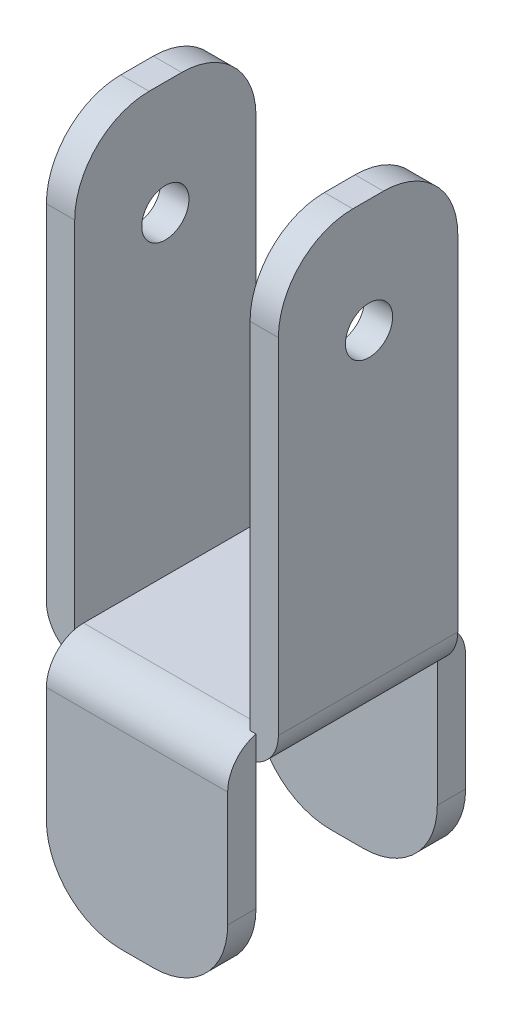
ISO-10303-21;
HEADER;
FILE_DESCRIPTION(('STEP AP214'),'2;1');
FILE_NAME('part.step','',(''),(''),'','','');
FILE_SCHEMA(('AUTOMOTIVE_DESIGN { 1 0 10303 214 1 1 1 1 }'));
ENDSEC;
DATA;
#1=APPLICATION_CONTEXT('core data for automotive mechanical design processes');
#2=APPLICATION_PROTOCOL_DEFINITION('international standard','automotive_design',2000,#1);
#3=PRODUCT_CONTEXT('',#1,'mechanical');
#4=PRODUCT('Part','Part','',(#3));
#5=PRODUCT_RELATED_PRODUCT_CATEGORY('part','',(#4));
#6=PRODUCT_DEFINITION_FORMATION('','',#4);
#7=PRODUCT_DEFINITION_CONTEXT('part definition',#1,'design');
#8=PRODUCT_DEFINITION('design','',#6,#7);
#9=PRODUCT_DEFINITION_SHAPE('','',#8);
#10=(LENGTH_UNIT() NAMED_UNIT(*) SI_UNIT(.MILLI.,.METRE.));
#11=(NAMED_UNIT(*) PLANE_ANGLE_UNIT() SI_UNIT($,.RADIAN.));
#12=(NAMED_UNIT(*) SI_UNIT($,.STERADIAN.) SOLID_ANGLE_UNIT());
#13=UNCERTAINTY_MEASURE_WITH_UNIT(LENGTH_MEASURE(1.E-05),#10,'distance_accuracy_value','');
#14=(GEOMETRIC_REPRESENTATION_CONTEXT(3) GLOBAL_UNCERTAINTY_ASSIGNED_CONTEXT((#13)) GLOBAL_UNIT_ASSIGNED_CONTEXT((#10,
#11,#12)) REPRESENTATION_CONTEXT('',''));
#15=CARTESIAN_POINT('',(0.,0.,0.));
#16=DIRECTION('',(0.,0.,1.));
#17=DIRECTION('',(1.,0.,0.));
#18=AXIS2_PLACEMENT_3D('',#15,#16,#17);
#19=CARTESIAN_POINT('',(3.81,-10.0000000000001,0.));
#20=DIRECTION('',(0.,0.,-1.));
#21=DIRECTION('',(-1.,0.,0.));
#22=AXIS2_PLACEMENT_3D('',#19,#20,#21);
#23=PLANE('',#22);
#24=DIRECTION('',(0.,-1.,0.));
#25=VECTOR('',#24,1.);
#26=CARTESIAN_POINT('',(3.81,-57.5348733929534,0.));
#27=LINE('',#26,#25);
#28=CARTESIAN_POINT('',(3.81,-57.6785476213438,0.));
#29=VERTEX_POINT('',#28);
#30=CARTESIAN_POINT('',(3.81,-61.201199164563,0.));
#31=VERTEX_POINT('',#30);
#32=EDGE_CURVE('E355',#29,#31,#27,.T.);
#33=ORIENTED_EDGE('',*,*,#32,.F.);
#34=DIRECTION('',(0.,-1.,0.));
#35=VECTOR('',#34,1.);
#36=CARTESIAN_POINT('',(3.81,-10.0000000000001,0.));
#37=LINE('',#36,#35);
#38=CARTESIAN_POINT('',(3.81,-10.0000000000001,0.));
#39=VERTEX_POINT('',#38);
#40=EDGE_CURVE('E418',#39,#29,#37,.T.);
#41=ORIENTED_EDGE('',*,*,#40,.F.);
#42=DIRECTION('',(-1.,0.,0.));
#43=VECTOR('',#42,1.);
#44=CARTESIAN_POINT('',(3.81,-10.0000000000001,0.));
#45=LINE('',#44,#43);
#46=CARTESIAN_POINT('',(0.,-10.0000000000001,0.));
#47=VERTEX_POINT('',#46);
#48=EDGE_CURVE('E422',#39,#47,#45,.T.);
#49=ORIENTED_EDGE('',*,*,#48,.T.);
#50=DIRECTION('',(0.,-1.,0.));
#51=VECTOR('',#50,1.);
#52=CARTESIAN_POINT('',(0.,-10.0000000000001,0.));
#53=LINE('',#52,#51);
#54=CARTESIAN_POINT('',(0.,-56.3448733929534,0.));
#55=VERTEX_POINT('',#54);
#56=EDGE_CURVE('E412',#47,#55,#53,.T.);
#57=ORIENTED_EDGE('',*,*,#56,.T.);
#58=CARTESIAN_POINT('',(5.,-56.3448733929534,0.));
#59=DIRECTION('',(0.,0.,-1.));
#60=DIRECTION('',(-1.,0.,0.));
#61=AXIS2_PLACEMENT_3D('',#58,#59,#60);
#62=CIRCLE('',#61,5.);
#63=EDGE_CURVE('E260',#55,#31,#62,.F.);
#64=ORIENTED_EDGE('',*,*,#63,.T.);
#65=EDGE_LOOP('',(#33,#41,#49,#57,#64));
#66=FACE_BOUND('',#65,.T.);
#67=ADVANCED_FACE('F33',(#66),#23,.F.);
#68=DIRECTION('',(0.,1.,0.));
#69=VECTOR('',#68,1.);
#70=CARTESIAN_POINT('',(28.194,-57.5348733929534,0.));
#71=LINE('',#70,#69);
#72=CARTESIAN_POINT('',(28.194,-60.9318642554384,0.));
#73=VERTEX_POINT('',#72);
#74=CARTESIAN_POINT('',(28.194,-57.6785476213438,0.));
#75=VERTEX_POINT('',#74);
#76=EDGE_CURVE('E339',#73,#75,#71,.T.);
#77=ORIENTED_EDGE('',*,*,#76,.F.);
#78=CARTESIAN_POINT('',(26.2041470337036,-56.3448733929534,0.));
#79=DIRECTION('',(0.,0.,-1.));
#80=DIRECTION('',(-1.,0.,0.));
#81=AXIS2_PLACEMENT_3D('',#78,#79,#80);
#82=CIRCLE('',#81,5.);
#83=CARTESIAN_POINT('',(31.2041470337036,-56.3448733929534,0.));
#84=VERTEX_POINT('',#83);
#85=EDGE_CURVE('E472',#73,#84,#82,.F.);
#86=ORIENTED_EDGE('',*,*,#85,.T.);
#87=DIRECTION('',(0.,-1.,0.));
#88=VECTOR('',#87,1.);
#89=CARTESIAN_POINT('',(31.2041470337036,-61.3448733929534,0.));
#90=LINE('',#89,#88);
#91=CARTESIAN_POINT('',(31.2041470337036,-10.,0.));
#92=VERTEX_POINT('',#91);
#93=EDGE_CURVE('E382',#92,#84,#90,.T.);
#94=ORIENTED_EDGE('',*,*,#93,.F.);
#95=DIRECTION('',(-1.,0.,0.));
#96=VECTOR('',#95,1.);
#97=CARTESIAN_POINT('',(3.81,-10.,0.));
#98=LINE('',#97,#96);
#99=CARTESIAN_POINT('',(27.3941470337036,-10.,0.));
#100=VERTEX_POINT('',#99);
#101=EDGE_CURVE('E453',#92,#100,#98,.T.);
#102=ORIENTED_EDGE('',*,*,#101,.T.);
#103=DIRECTION('',(0.,-1.,0.));
#104=VECTOR('',#103,1.);
#105=CARTESIAN_POINT('',(27.3941470337036,-61.3448733929534,0.));
#106=LINE('',#105,#104);
#107=CARTESIAN_POINT('',(27.3941470337036,-57.6785476213438,0.));
#108=VERTEX_POINT('',#107);
#109=EDGE_CURVE('E48',#100,#108,#106,.T.);
#110=ORIENTED_EDGE('',*,*,#109,.T.);
#111=DIRECTION('',(-1.,0.,0.));
#112=VECTOR('',#111,1.);
#113=CARTESIAN_POINT('',(27.3941470337036,-57.6785476213438,0.));
#114=LINE('',#113,#112);
#115=EDGE_CURVE('E11',#108,#75,#114,.F.);
#116=ORIENTED_EDGE('',*,*,#115,.T.);
#117=EDGE_LOOP('',(#77,#86,#94,#102,#110,#116));
#118=FACE_BOUND('',#117,.T.);
#119=ADVANCED_FACE('F551',(#118),#23,.F.);
#120=CARTESIAN_POINT('',(3.81,-10.,-24.384));
#121=DIRECTION('',(0.,0.,1.));
#122=DIRECTION('',(0.,-1.,0.));
#123=AXIS2_PLACEMENT_3D('',#120,#121,#122);
#124=PLANE('',#123);
#125=DIRECTION('',(1.,0.,0.));
#126=VECTOR('',#125,1.);
#127=CARTESIAN_POINT('',(3.81,-57.693007505037,-24.384));
#128=LINE('',#127,#126);
#129=CARTESIAN_POINT('',(3.81,-57.693007505037,-24.384));
#130=VERTEX_POINT('',#129);
#131=CARTESIAN_POINT('',(27.3941470337036,-57.693007505037,-24.384));
#132=VERTEX_POINT('',#131);
#133=EDGE_CURVE('E349',#130,#132,#128,.T.);
#134=ORIENTED_EDGE('',*,*,#133,.F.);
#135=DIRECTION('',(0.,-1.,0.));
#136=VECTOR('',#135,1.);
#137=CARTESIAN_POINT('',(3.81,-57.693007505037,-24.384));
#138=LINE('',#137,#136);
#139=CARTESIAN_POINT('',(3.81,-61.201199164563,-24.384));
#140=VERTEX_POINT('',#139);
#141=EDGE_CURVE('E366',#130,#140,#138,.T.);
#142=ORIENTED_EDGE('',*,*,#141,.T.);
#143=CARTESIAN_POINT('',(5.,-56.3448733929534,-24.384));
#144=DIRECTION('',(0.,0.,1.));
#145=DIRECTION('',(0.,-1.,0.));
#146=AXIS2_PLACEMENT_3D('',#143,#144,#145);
#147=CIRCLE('',#146,5.);
#148=CARTESIAN_POINT('',(0.,-56.3448733929534,-24.384));
#149=VERTEX_POINT('',#148);
#150=EDGE_CURVE('E241',#140,#149,#147,.F.);
#151=ORIENTED_EDGE('',*,*,#150,.T.);
#152=DIRECTION('',(0.,1.,0.));
#153=VECTOR('',#152,1.);
#154=CARTESIAN_POINT('',(0.,-10.,-24.384));
#155=LINE('',#154,#153);
#156=CARTESIAN_POINT('',(0.,-10.,-24.384));
#157=VERTEX_POINT('',#156);
#158=EDGE_CURVE('E407',#149,#157,#155,.T.);
#159=ORIENTED_EDGE('',*,*,#158,.T.);
#160=DIRECTION('',(-1.,0.,0.));
#161=VECTOR('',#160,1.);
#162=CARTESIAN_POINT('',(3.81,-10.,-24.384));
#163=LINE('',#162,#161);
#164=CARTESIAN_POINT('',(3.81,-10.,-24.384));
#165=VERTEX_POINT('',#164);
#166=EDGE_CURVE('E440',#165,#157,#163,.T.);
#167=ORIENTED_EDGE('',*,*,#166,.F.);
#168=DIRECTION('',(0.,1.,0.));
#169=VECTOR('',#168,1.);
#170=CARTESIAN_POINT('',(3.81,-10.,-24.384));
#171=LINE('',#170,#169);
#172=CARTESIAN_POINT('',(3.81,-57.5348733929534,-24.384));
#173=VERTEX_POINT('',#172);
#174=EDGE_CURVE('E408',#173,#165,#171,.T.);
#175=ORIENTED_EDGE('',*,*,#174,.F.);
#176=DIRECTION('',(1.,0.,0.));
#177=VECTOR('',#176,1.);
#178=CARTESIAN_POINT('',(0.,-57.5348733929534,-24.384));
#179=LINE('',#178,#177);
#180=CARTESIAN_POINT('',(27.3941470337036,-57.5348733929534,-24.384));
#181=VERTEX_POINT('',#180);
#182=EDGE_CURVE('E391',#173,#181,#179,.T.);
#183=ORIENTED_EDGE('',*,*,#182,.T.);
#184=DIRECTION('',(0.,1.,0.));
#185=VECTOR('',#184,1.);
#186=CARTESIAN_POINT('',(27.3941470337036,-61.3448733929534,-24.384));
#187=LINE('',#186,#185);
#188=EDGE_CURVE('E252',#132,#181,#187,.T.);
#189=ORIENTED_EDGE('',*,*,#188,.F.);
#190=EDGE_LOOP('',(#134,#142,#151,#159,#167,#175,#183,#189));
#191=FACE_BOUND('',#190,.T.);
#192=ADVANCED_FACE('F478',(#191),#124,.F.);
#193=CARTESIAN_POINT('',(27.3941470337036,-61.3448733929534,-24.384));
#194=DIRECTION('',(-1.,0.,0.));
#195=DIRECTION('',(0.,0.,1.));
#196=AXIS2_PLACEMENT_3D('',#193,#194,#195);
#197=PLANE('',#196);
#198=DIRECTION('',(0.,1.,0.));
#199=VECTOR('',#198,1.);
#200=CARTESIAN_POINT('',(27.3941470337036,-61.3448733929534,-24.13));
#201=LINE('',#200,#199);
#202=CARTESIAN_POINT('',(27.3941470337036,-61.201199164563,-24.13));
#203=VERTEX_POINT('',#202);
#204=CARTESIAN_POINT('',(27.3941470337036,-57.5348733929534,-24.13));
#205=VERTEX_POINT('',#204);
#206=EDGE_CURVE('E394',#203,#205,#201,.T.);
#207=ORIENTED_EDGE('',*,*,#206,.F.);
#208=DIRECTION('',(0.,0.,-1.));
#209=VECTOR('',#208,1.);
#210=CARTESIAN_POINT('',(27.3941470337036,-61.201199164563,-24.13));
#211=LINE('',#210,#209);
#212=CARTESIAN_POINT('',(27.3941470337036,-61.201199164563,-24.384));
#213=VERTEX_POINT('',#212);
#214=EDGE_CURVE('E466',#203,#213,#211,.T.);
#215=ORIENTED_EDGE('',*,*,#214,.T.);
#216=EDGE_CURVE('E404',#213,#132,#187,.T.);
#217=ORIENTED_EDGE('',*,*,#216,.T.);
#218=ORIENTED_EDGE('',*,*,#188,.T.);
#219=DIRECTION('',(0.,0.,1.));
#220=VECTOR('',#219,1.);
#221=CARTESIAN_POINT('',(27.3941470337036,-57.5348733929534,-24.384));
#222=LINE('',#221,#220);
#223=EDGE_CURVE('E398',#181,#205,#222,.T.);
#224=ORIENTED_EDGE('',*,*,#223,.T.);
#225=EDGE_LOOP('',(#207,#215,#217,#218,#224));
#226=FACE_BOUND('',#225,.T.);
#227=ADVANCED_FACE('F513',(#226),#197,.F.);
#228=CARTESIAN_POINT('',(3.81,-10.,-14.384));
#229=DIRECTION('',(-1.,0.,0.));
#230=DIRECTION('',(0.,0.,1.));
#231=AXIS2_PLACEMENT_3D('',#228,#229,#230);
#232=CYLINDRICAL_SURFACE('',#231,10.);
#233=CARTESIAN_POINT('',(0.,-10.,-14.384));
#234=DIRECTION('',(1.,0.,0.));
#235=DIRECTION('',(0.,0.,1.));
#236=AXIS2_PLACEMENT_3D('',#233,#234,#235);
#237=CIRCLE('',#236,10.);
#238=CARTESIAN_POINT('',(0.,0.,-14.384));
#239=VERTEX_POINT('',#238);
#240=EDGE_CURVE('E424',#157,#239,#237,.T.);
#241=ORIENTED_EDGE('',*,*,#240,.T.);
#242=DIRECTION('',(-1.,0.,0.));
#243=VECTOR('',#242,1.);
#244=CARTESIAN_POINT('',(3.81,0.,-14.384));
#245=LINE('',#244,#243);
#246=CARTESIAN_POINT('',(3.81,0.,-14.384));
#247=VERTEX_POINT('',#246);
#248=EDGE_CURVE('E437',#247,#239,#245,.T.);
#249=ORIENTED_EDGE('',*,*,#248,.F.);
#250=CARTESIAN_POINT('',(3.81,-10.,-14.384));
#251=DIRECTION('',(1.,0.,0.));
#252=DIRECTION('',(0.,0.,1.));
#253=AXIS2_PLACEMENT_3D('',#250,#251,#252);
#254=CIRCLE('',#253,10.);
#255=EDGE_CURVE('E411',#165,#247,#254,.T.);
#256=ORIENTED_EDGE('',*,*,#255,.F.);
#257=ORIENTED_EDGE('',*,*,#166,.T.);
#258=EDGE_LOOP('',(#241,#249,#256,#257));
#259=FACE_BOUND('',#258,.T.);
#260=ADVANCED_FACE('F502',(#259),#232,.T.);
#261=CARTESIAN_POINT('',(3.81,0.,-10.0000000000001));
#262=DIRECTION('',(0.,-1.,0.));
#263=DIRECTION('',(0.,0.,-1.));
#264=AXIS2_PLACEMENT_3D('',#261,#262,#263);
#265=PLANE('',#264);
#266=DIRECTION('',(0.,0.,1.));
#267=VECTOR('',#266,1.);
#268=CARTESIAN_POINT('',(0.,0.,-10.0000000000001));
#269=LINE('',#268,#267);
#270=CARTESIAN_POINT('',(0.,0.,-10.0000000000001));
#271=VERTEX_POINT('',#270);
#272=EDGE_CURVE('E426',#239,#271,#269,.T.);
#273=ORIENTED_EDGE('',*,*,#272,.T.);
#274=DIRECTION('',(-1.,0.,0.));
#275=VECTOR('',#274,1.);
#276=CARTESIAN_POINT('',(3.81,0.,-10.0000000000001));
#277=LINE('',#276,#275);
#278=CARTESIAN_POINT('',(3.81,0.,-10.0000000000001));
#279=VERTEX_POINT('',#278);
#280=EDGE_CURVE('E434',#279,#271,#277,.T.);
#281=ORIENTED_EDGE('',*,*,#280,.F.);
#282=DIRECTION('',(0.,0.,1.));
#283=VECTOR('',#282,1.);
#284=CARTESIAN_POINT('',(3.81,0.,-10.0000000000001));
#285=LINE('',#284,#283);
#286=EDGE_CURVE('E414',#247,#279,#285,.T.);
#287=ORIENTED_EDGE('',*,*,#286,.F.);
#288=ORIENTED_EDGE('',*,*,#248,.T.);
#289=EDGE_LOOP('',(#273,#281,#287,#288));
#290=FACE_BOUND('',#289,.T.);
#291=ADVANCED_FACE('F499',(#290),#265,.F.);
#292=CARTESIAN_POINT('',(3.81,-10.,-10.));
#293=DIRECTION('',(-1.,0.,0.));
#294=DIRECTION('',(0.,0.,1.));
#295=AXIS2_PLACEMENT_3D('',#292,#293,#294);
#296=CYLINDRICAL_SURFACE('',#295,10.);
#297=CARTESIAN_POINT('',(0.,-10.,-10.));
#298=DIRECTION('',(1.,0.,0.));
#299=DIRECTION('',(0.,0.,-1.));
#300=AXIS2_PLACEMENT_3D('',#297,#298,#299);
#301=CIRCLE('',#300,10.);
#302=EDGE_CURVE('E428',#271,#47,#301,.T.);
#303=ORIENTED_EDGE('',*,*,#302,.T.);
#304=ORIENTED_EDGE('',*,*,#48,.F.);
#305=CARTESIAN_POINT('',(3.81,-10.,-10.));
#306=DIRECTION('',(1.,0.,0.));
#307=DIRECTION('',(0.,0.,-1.));
#308=AXIS2_PLACEMENT_3D('',#305,#306,#307);
#309=CIRCLE('',#308,10.);
#310=EDGE_CURVE('E416',#279,#39,#309,.T.);
#311=ORIENTED_EDGE('',*,*,#310,.F.);
#312=ORIENTED_EDGE('',*,*,#280,.T.);
#313=EDGE_LOOP('',(#303,#304,#311,#312));
#314=FACE_BOUND('',#313,.T.);
#315=ADVANCED_FACE('F494',(#314),#296,.T.);
#316=CARTESIAN_POINT('',(3.81,-10.,-10.));
#317=DIRECTION('',(1.,0.,0.));
#318=DIRECTION('',(0.,0.,-1.));
#319=AXIS2_PLACEMENT_3D('',#316,#317,#318);
#320=PLANE('',#319);
#321=CARTESIAN_POINT('',(3.81,-15.24,-12.192));
#322=DIRECTION('',(1.,0.,0.));
#323=DIRECTION('',(0.,0.,-1.));
#324=AXIS2_PLACEMENT_3D('',#321,#322,#323);
#325=CIRCLE('',#324,3.17499999999999);
#326=CARTESIAN_POINT('',(3.81,-15.24,-15.367));
#327=VERTEX_POINT('',#326);
#328=EDGE_CURVE('E37',#327,#327,#325,.T.);
#329=ORIENTED_EDGE('',*,*,#328,.F.);
#330=EDGE_LOOP('',(#329));
#331=FACE_BOUND('',#330,.T.);
#332=ORIENTED_EDGE('',*,*,#174,.T.);
#333=ORIENTED_EDGE('',*,*,#255,.T.);
#334=ORIENTED_EDGE('',*,*,#286,.T.);
#335=ORIENTED_EDGE('',*,*,#310,.T.);
#336=ORIENTED_EDGE('',*,*,#40,.T.);
#337=CARTESIAN_POINT('',(3.81,-62.5348733929534,-1.19));
#338=DIRECTION('',(1.,0.,0.));
#339=DIRECTION('',(0.,0.,-1.));
#340=AXIS2_PLACEMENT_3D('',#337,#338,#339);
#341=CIRCLE('',#340,5.);
#342=CARTESIAN_POINT('',(3.81,-57.5348733929534,-1.19));
#343=VERTEX_POINT('',#342);
#344=EDGE_CURVE('E320',#29,#343,#341,.F.);
#345=ORIENTED_EDGE('',*,*,#344,.T.);
#346=DIRECTION('',(0.,0.,-1.));
#347=VECTOR('',#346,1.);
#348=CARTESIAN_POINT('',(3.81,-57.5348733929534,0.));
#349=LINE('',#348,#347);
#350=EDGE_CURVE('E420',#343,#173,#349,.T.);
#351=ORIENTED_EDGE('',*,*,#350,.T.);
#352=EDGE_LOOP('',(#332,#333,#334,#335,#336,#345,#351));
#353=FACE_BOUND('',#352,.T.);
#354=ADVANCED_FACE('F507',(#331,#353),#320,.T.);
#355=CARTESIAN_POINT('',(0.,-10.,-10.));
#356=DIRECTION('',(1.,0.,0.));
#357=DIRECTION('',(0.,0.,-1.));
#358=AXIS2_PLACEMENT_3D('',#355,#356,#357);
#359=PLANE('',#358);
#360=CARTESIAN_POINT('',(0.,-15.24,-12.192));
#361=DIRECTION('',(-1.,0.,0.));
#362=DIRECTION('',(0.,0.,1.));
#363=AXIS2_PLACEMENT_3D('',#360,#361,#362);
#364=CIRCLE('',#363,3.175);
#365=CARTESIAN_POINT('',(0.,-15.24,-9.017));
#366=VERTEX_POINT('',#365);
#367=EDGE_CURVE('E618',#366,#366,#364,.T.);
#368=ORIENTED_EDGE('',*,*,#367,.F.);
#369=EDGE_LOOP('',(#368));
#370=FACE_BOUND('',#369,.T.);
#371=ORIENTED_EDGE('',*,*,#158,.F.);
#372=DIRECTION('',(0.,0.,-1.));
#373=VECTOR('',#372,1.);
#374=CARTESIAN_POINT('',(0.,-56.3448733929534,-10.));
#375=LINE('',#374,#373);
#376=EDGE_CURVE('E261',#149,#55,#375,.F.);
#377=ORIENTED_EDGE('',*,*,#376,.T.);
#378=ORIENTED_EDGE('',*,*,#56,.F.);
#379=ORIENTED_EDGE('',*,*,#302,.F.);
#380=ORIENTED_EDGE('',*,*,#272,.F.);
#381=ORIENTED_EDGE('',*,*,#240,.F.);
#382=EDGE_LOOP('',(#371,#377,#378,#379,#380,#381));
#383=FACE_BOUND('',#382,.T.);
#384=ADVANCED_FACE('F484',(#370,#383),#359,.F.);
#385=CARTESIAN_POINT('',(0.,-57.5348733929534,0.));
#386=DIRECTION('',(0.,1.,0.));
#387=DIRECTION('',(0.,0.,1.));
#388=AXIS2_PLACEMENT_3D('',#385,#386,#387);
#389=PLANE('',#388);
#390=ORIENTED_EDGE('',*,*,#350,.F.);
#391=DIRECTION('',(-1.,0.,0.));
#392=VECTOR('',#391,1.);
#393=CARTESIAN_POINT('',(0.,-57.5348733929534,-1.19));
#394=LINE('',#393,#392);
#395=CARTESIAN_POINT('',(27.3941470337036,-57.5348733929534,-1.19));
#396=VERTEX_POINT('',#395);
#397=EDGE_CURVE('E316',#343,#396,#394,.F.);
#398=ORIENTED_EDGE('',*,*,#397,.T.);
#399=EDGE_CURVE('E328',#205,#396,#222,.T.);
#400=ORIENTED_EDGE('',*,*,#399,.F.);
#401=ORIENTED_EDGE('',*,*,#223,.F.);
#402=ORIENTED_EDGE('',*,*,#182,.F.);
#403=EDGE_LOOP('',(#390,#398,#400,#401,#402));
#404=FACE_BOUND('',#403,.T.);
#405=ADVANCED_FACE('F510',(#404),#389,.T.);
#406=CARTESIAN_POINT('',(0.,-61.3448733929534,0.));
#407=DIRECTION('',(0.,1.,0.));
#408=DIRECTION('',(0.,0.,1.));
#409=AXIS2_PLACEMENT_3D('',#406,#407,#408);
#410=PLANE('',#409);
#411=DIRECTION('',(-1.,0.,0.));
#412=VECTOR('',#411,1.);
#413=CARTESIAN_POINT('',(0.,-61.3448733929534,0.));
#414=LINE('',#413,#412);
#415=CARTESIAN_POINT('',(26.2041470337036,-61.3448733929534,0.));
#416=VERTEX_POINT('',#415);
#417=CARTESIAN_POINT('',(5.,-61.3448733929534,0.));
#418=VERTEX_POINT('',#417);
#419=EDGE_CURVE('E245',#416,#418,#414,.T.);
#420=ORIENTED_EDGE('',*,*,#419,.T.);
#421=DIRECTION('',(0.,0.,-1.));
#422=VECTOR('',#421,1.);
#423=CARTESIAN_POINT('',(5.,-61.3448733929534,0.));
#424=LINE('',#423,#422);
#425=CARTESIAN_POINT('',(5.,-61.3448733929534,-24.384));
#426=VERTEX_POINT('',#425);
#427=EDGE_CURVE('E230',#418,#426,#424,.T.);
#428=ORIENTED_EDGE('',*,*,#427,.T.);
#429=DIRECTION('',(1.,0.,0.));
#430=VECTOR('',#429,1.);
#431=CARTESIAN_POINT('',(0.,-61.3448733929534,-24.384));
#432=LINE('',#431,#430);
#433=CARTESIAN_POINT('',(26.2041470337036,-61.3448733929534,-24.384));
#434=VERTEX_POINT('',#433);
#435=EDGE_CURVE('E253',#426,#434,#432,.T.);
#436=ORIENTED_EDGE('',*,*,#435,.T.);
#437=DIRECTION('',(0.,0.,-1.));
#438=VECTOR('',#437,1.);
#439=CARTESIAN_POINT('',(26.2041470337036,-61.3448733929534,0.));
#440=LINE('',#439,#438);
#441=EDGE_CURVE('E248',#434,#416,#440,.F.);
#442=ORIENTED_EDGE('',*,*,#441,.T.);
#443=EDGE_LOOP('',(#420,#428,#436,#442));
#444=FACE_BOUND('',#443,.T.);
#445=ADVANCED_FACE('F246',(#444),#410,.F.);
#446=CARTESIAN_POINT('',(31.2041470337036,-61.3448733929534,-24.13));
#447=DIRECTION('',(0.,0.,1.));
#448=DIRECTION('',(1.,0.,0.));
#449=AXIS2_PLACEMENT_3D('',#446,#447,#448);
#450=PLANE('',#449);
#451=DIRECTION('',(0.,1.,0.));
#452=VECTOR('',#451,1.);
#453=CARTESIAN_POINT('',(31.2041470337036,-61.3448733929534,-24.13));
#454=LINE('',#453,#452);
#455=CARTESIAN_POINT('',(31.2041470337036,-56.3448733929534,-24.13));
#456=VERTEX_POINT('',#455);
#457=CARTESIAN_POINT('',(31.2041470337036,-10.,-24.13));
#458=VERTEX_POINT('',#457);
#459=EDGE_CURVE('E385',#456,#458,#454,.T.);
#460=ORIENTED_EDGE('',*,*,#459,.F.);
#461=CARTESIAN_POINT('',(26.2041470337036,-56.3448733929534,-24.13));
#462=DIRECTION('',(0.,0.,1.));
#463=DIRECTION('',(1.,0.,0.));
#464=AXIS2_PLACEMENT_3D('',#461,#462,#463);
#465=CIRCLE('',#464,5.);
#466=EDGE_CURVE('E464',#456,#203,#465,.F.);
#467=ORIENTED_EDGE('',*,*,#466,.T.);
#468=ORIENTED_EDGE('',*,*,#206,.T.);
#469=CARTESIAN_POINT('',(27.3941470337036,-10.,-24.13));
#470=VERTEX_POINT('',#469);
#471=EDGE_CURVE('E393',#205,#470,#201,.T.);
#472=ORIENTED_EDGE('',*,*,#471,.T.);
#473=DIRECTION('',(-1.,0.,0.));
#474=VECTOR('',#473,1.);
#475=CARTESIAN_POINT('',(31.2041470337036,-10.,-24.13));
#476=LINE('',#475,#474);
#477=EDGE_CURVE('E448',#470,#458,#476,.F.);
#478=ORIENTED_EDGE('',*,*,#477,.T.);
#479=EDGE_LOOP('',(#460,#467,#468,#472,#478));
#480=FACE_BOUND('',#479,.T.);
#481=ADVANCED_FACE('F559',(#480),#450,.F.);
#482=CARTESIAN_POINT('',(31.2041470337036,0.,0.));
#483=DIRECTION('',(0.,-1.,0.));
#484=DIRECTION('',(0.,0.,-1.));
#485=AXIS2_PLACEMENT_3D('',#482,#483,#484);
#486=PLANE('',#485);
#487=DIRECTION('',(0.,0.,1.));
#488=VECTOR('',#487,1.);
#489=CARTESIAN_POINT('',(27.3941470337036,0.,0.));
#490=LINE('',#489,#488);
#491=CARTESIAN_POINT('',(27.3941470337036,0.,-14.13));
#492=VERTEX_POINT('',#491);
#493=CARTESIAN_POINT('',(27.3941470337036,0.,-9.99999999999999));
#494=VERTEX_POINT('',#493);
#495=EDGE_CURVE('E386',#492,#494,#490,.T.);
#496=ORIENTED_EDGE('',*,*,#495,.T.);
#497=DIRECTION('',(-1.,0.,0.));
#498=VECTOR('',#497,1.);
#499=CARTESIAN_POINT('',(31.2041470337036,0.,-10.));
#500=LINE('',#499,#498);
#501=CARTESIAN_POINT('',(31.2041470337036,0.,-9.99999999999999));
#502=VERTEX_POINT('',#501);
#503=EDGE_CURVE('E457',#494,#502,#500,.F.);
#504=ORIENTED_EDGE('',*,*,#503,.T.);
#505=DIRECTION('',(0.,0.,1.));
#506=VECTOR('',#505,1.);
#507=CARTESIAN_POINT('',(31.2041470337036,0.,0.));
#508=LINE('',#507,#506);
#509=CARTESIAN_POINT('',(31.2041470337036,0.,-14.13));
#510=VERTEX_POINT('',#509);
#511=EDGE_CURVE('E388',#510,#502,#508,.T.);
#512=ORIENTED_EDGE('',*,*,#511,.F.);
#513=DIRECTION('',(-1.,0.,0.));
#514=VECTOR('',#513,1.);
#515=CARTESIAN_POINT('',(31.2041470337036,0.,-14.13));
#516=LINE('',#515,#514);
#517=EDGE_CURVE('E443',#510,#492,#516,.T.);
#518=ORIENTED_EDGE('',*,*,#517,.T.);
#519=EDGE_LOOP('',(#496,#504,#512,#518));
#520=FACE_BOUND('',#519,.T.);
#521=ADVANCED_FACE('F567',(#520),#486,.F.);
#522=CARTESIAN_POINT('',(31.2041470337036,0.,0.));
#523=DIRECTION('',(-1.,0.,0.));
#524=DIRECTION('',(0.,0.,1.));
#525=AXIS2_PLACEMENT_3D('',#522,#523,#524);
#526=PLANE('',#525);
#527=CARTESIAN_POINT('',(31.2041470337036,-15.24,-12.192));
#528=DIRECTION('',(-1.,0.,0.));
#529=DIRECTION('',(0.,0.,1.));
#530=AXIS2_PLACEMENT_3D('',#527,#528,#529);
#531=CIRCLE('',#530,3.17499999999999);
#532=CARTESIAN_POINT('',(31.2041470337036,-15.24,-9.01700000000001));
#533=VERTEX_POINT('',#532);
#534=EDGE_CURVE('E614',#533,#533,#531,.T.);
#535=ORIENTED_EDGE('',*,*,#534,.T.);
#536=EDGE_LOOP('',(#535));
#537=FACE_BOUND('',#536,.T.);
#538=ORIENTED_EDGE('',*,*,#93,.T.);
#539=DIRECTION('',(0.,0.,-1.));
#540=VECTOR('',#539,1.);
#541=CARTESIAN_POINT('',(31.2041470337036,-56.3448733929534,0.));
#542=LINE('',#541,#540);
#543=EDGE_CURVE('E461',#84,#456,#542,.T.);
#544=ORIENTED_EDGE('',*,*,#543,.T.);
#545=ORIENTED_EDGE('',*,*,#459,.T.);
#546=CARTESIAN_POINT('',(31.2041470337036,-10.,-14.13));
#547=DIRECTION('',(-1.,0.,0.));
#548=DIRECTION('',(0.,0.,1.));
#549=AXIS2_PLACEMENT_3D('',#546,#547,#548);
#550=CIRCLE('',#549,10.);
#551=EDGE_CURVE('E451',#458,#510,#550,.F.);
#552=ORIENTED_EDGE('',*,*,#551,.T.);
#553=ORIENTED_EDGE('',*,*,#511,.T.);
#554=CARTESIAN_POINT('',(31.2041470337036,-10.,-10.));
#555=DIRECTION('',(-1.,0.,0.));
#556=DIRECTION('',(0.,0.,1.));
#557=AXIS2_PLACEMENT_3D('',#554,#555,#556);
#558=CIRCLE('',#557,10.);
#559=EDGE_CURVE('E459',#502,#92,#558,.F.);
#560=ORIENTED_EDGE('',*,*,#559,.T.);
#561=EDGE_LOOP('',(#538,#544,#545,#552,#553,#560));
#562=FACE_BOUND('',#561,.T.);
#563=ADVANCED_FACE('F555',(#537,#562),#526,.F.);
#564=CARTESIAN_POINT('',(27.3941470337036,0.,0.));
#565=DIRECTION('',(-1.,0.,0.));
#566=DIRECTION('',(0.,0.,1.));
#567=AXIS2_PLACEMENT_3D('',#564,#565,#566);
#568=PLANE('',#567);
#569=CARTESIAN_POINT('',(27.3941470337036,-15.24,-12.192));
#570=DIRECTION('',(-1.,0.,0.));
#571=DIRECTION('',(0.,0.,1.));
#572=AXIS2_PLACEMENT_3D('',#569,#570,#571);
#573=CIRCLE('',#572,3.17499999999999);
#574=CARTESIAN_POINT('',(27.3941470337036,-15.24,-9.017));
#575=VERTEX_POINT('',#574);
#576=EDGE_CURVE('E613',#575,#575,#573,.T.);
#577=ORIENTED_EDGE('',*,*,#576,.F.);
#578=EDGE_LOOP('',(#577));
#579=FACE_BOUND('',#578,.T.);
#580=ORIENTED_EDGE('',*,*,#109,.F.);
#581=CARTESIAN_POINT('',(27.3941470337036,-10.,-10.));
#582=DIRECTION('',(-1.,0.,0.));
#583=DIRECTION('',(0.,0.,1.));
#584=AXIS2_PLACEMENT_3D('',#581,#582,#583);
#585=CIRCLE('',#584,10.);
#586=EDGE_CURVE('E455',#100,#494,#585,.T.);
#587=ORIENTED_EDGE('',*,*,#586,.T.);
#588=ORIENTED_EDGE('',*,*,#495,.F.);
#589=CARTESIAN_POINT('',(27.3941470337036,-10.,-14.13));
#590=DIRECTION('',(-1.,0.,0.));
#591=DIRECTION('',(0.,0.,1.));
#592=AXIS2_PLACEMENT_3D('',#589,#590,#591);
#593=CIRCLE('',#592,10.);
#594=EDGE_CURVE('E446',#492,#470,#593,.T.);
#595=ORIENTED_EDGE('',*,*,#594,.T.);
#596=ORIENTED_EDGE('',*,*,#471,.F.);
#597=ORIENTED_EDGE('',*,*,#399,.T.);
#598=CARTESIAN_POINT('',(27.3941470337036,-62.5348733929534,-1.19));
#599=DIRECTION('',(-1.,0.,0.));
#600=DIRECTION('',(0.,0.,1.));
#601=AXIS2_PLACEMENT_3D('',#598,#599,#600);
#602=CIRCLE('',#601,5.);
#603=EDGE_CURVE('E42',#396,#108,#602,.F.);
#604=ORIENTED_EDGE('',*,*,#603,.T.);
#605=EDGE_LOOP('',(#580,#587,#588,#595,#596,#597,#604));
#606=FACE_BOUND('',#605,.T.);
#607=ADVANCED_FACE('F325',(#579,#606),#568,.T.);
#608=CARTESIAN_POINT('',(31.2041470337036,-10.,-14.13));
#609=DIRECTION('',(-1.,0.,0.));
#610=DIRECTION('',(0.,0.,1.));
#611=AXIS2_PLACEMENT_3D('',#608,#609,#610);
#612=CYLINDRICAL_SURFACE('',#611,10.);
#613=ORIENTED_EDGE('',*,*,#551,.F.);
#614=ORIENTED_EDGE('',*,*,#477,.F.);
#615=ORIENTED_EDGE('',*,*,#594,.F.);
#616=ORIENTED_EDGE('',*,*,#517,.F.);
#617=EDGE_LOOP('',(#613,#614,#615,#616));
#618=FACE_BOUND('',#617,.T.);
#619=ADVANCED_FACE('F570',(#618),#612,.T.);
#620=CARTESIAN_POINT('',(3.81,-10.,-10.));
#621=DIRECTION('',(-1.,0.,0.));
#622=DIRECTION('',(0.,0.,1.));
#623=AXIS2_PLACEMENT_3D('',#620,#621,#622);
#624=CYLINDRICAL_SURFACE('',#623,10.);
#625=ORIENTED_EDGE('',*,*,#559,.F.);
#626=ORIENTED_EDGE('',*,*,#503,.F.);
#627=ORIENTED_EDGE('',*,*,#586,.F.);
#628=ORIENTED_EDGE('',*,*,#101,.F.);
#629=EDGE_LOOP('',(#625,#626,#627,#628));
#630=FACE_BOUND('',#629,.T.);
#631=ADVANCED_FACE('F572',(#630),#624,.T.);
#632=CARTESIAN_POINT('',(26.2041470337036,-56.3448733929534,0.));
#633=DIRECTION('',(0.,0.,-1.));
#634=DIRECTION('',(-1.,0.,0.));
#635=AXIS2_PLACEMENT_3D('',#632,#633,#634);
#636=CYLINDRICAL_SURFACE('',#635,5.);
#637=EDGE_CURVE('E242',#416,#73,#82,.F.);
#638=ORIENTED_EDGE('',*,*,#637,.F.);
#639=ORIENTED_EDGE('',*,*,#441,.F.);
#640=CARTESIAN_POINT('',(26.2041470337036,-56.3448733929534,-24.384));
#641=DIRECTION('',(0.,0.,1.));
#642=DIRECTION('',(0.,-1.,0.));
#643=AXIS2_PLACEMENT_3D('',#640,#641,#642);
#644=CIRCLE('',#643,5.);
#645=EDGE_CURVE('E468',#213,#434,#644,.F.);
#646=ORIENTED_EDGE('',*,*,#645,.F.);
#647=ORIENTED_EDGE('',*,*,#214,.F.);
#648=ORIENTED_EDGE('',*,*,#466,.F.);
#649=ORIENTED_EDGE('',*,*,#543,.F.);
#650=ORIENTED_EDGE('',*,*,#85,.F.);
#651=EDGE_LOOP('',(#638,#639,#646,#647,#648,#649,#650));
#652=FACE_BOUND('',#651,.T.);
#653=ADVANCED_FACE('F547',(#652),#636,.T.);
#654=CARTESIAN_POINT('',(5.,-56.3448733929534,0.));
#655=DIRECTION('',(0.,0.,-1.));
#656=DIRECTION('',(-1.,0.,0.));
#657=AXIS2_PLACEMENT_3D('',#654,#655,#656);
#658=CYLINDRICAL_SURFACE('',#657,5.);
#659=ORIENTED_EDGE('',*,*,#63,.F.);
#660=ORIENTED_EDGE('',*,*,#376,.F.);
#661=ORIENTED_EDGE('',*,*,#150,.F.);
#662=EDGE_CURVE('E238',#426,#140,#147,.F.);
#663=ORIENTED_EDGE('',*,*,#662,.F.);
#664=ORIENTED_EDGE('',*,*,#427,.F.);
#665=EDGE_CURVE('E235',#31,#418,#62,.F.);
#666=ORIENTED_EDGE('',*,*,#665,.F.);
#667=EDGE_LOOP('',(#659,#660,#661,#663,#664,#666));
#668=FACE_BOUND('',#667,.T.);
#669=ADVANCED_FACE('F233',(#668),#658,.T.);
#670=CARTESIAN_POINT('',(0.,0.,-24.384));
#671=DIRECTION('',(0.,0.,-1.));
#672=DIRECTION('',(0.,1.,0.));
#673=AXIS2_PLACEMENT_3D('',#670,#671,#672);
#674=PLANE('',#673);
#675=DIRECTION('',(1.,0.,0.));
#676=VECTOR('',#675,1.);
#677=CARTESIAN_POINT('',(3.81,-88.173007505037,-24.384));
#678=LINE('',#677,#676);
#679=CARTESIAN_POINT('',(13.81,-88.173007505037,-24.384));
#680=VERTEX_POINT('',#679);
#681=CARTESIAN_POINT('',(18.194,-88.173007505037,-24.384));
#682=VERTEX_POINT('',#681);
#683=EDGE_CURVE('E376',#680,#682,#678,.T.);
#684=ORIENTED_EDGE('',*,*,#683,.T.);
#685=CARTESIAN_POINT('',(18.194,-78.173007505037,-24.384));
#686=DIRECTION('',(0.,0.,-1.));
#687=DIRECTION('',(0.,1.,0.));
#688=AXIS2_PLACEMENT_3D('',#685,#686,#687);
#689=CIRCLE('',#688,10.);
#690=CARTESIAN_POINT('',(28.194,-78.173007505037,-24.384));
#691=VERTEX_POINT('',#690);
#692=EDGE_CURVE('E285',#682,#691,#689,.F.);
#693=ORIENTED_EDGE('',*,*,#692,.T.);
#694=DIRECTION('',(0.,-1.,0.));
#695=VECTOR('',#694,1.);
#696=CARTESIAN_POINT('',(28.194,-57.693007505037,-24.384));
#697=LINE('',#696,#695);
#698=CARTESIAN_POINT('',(28.194,-57.693007505037,-24.384));
#699=VERTEX_POINT('',#698);
#700=EDGE_CURVE('E373',#699,#691,#697,.T.);
#701=ORIENTED_EDGE('',*,*,#700,.F.);
#702=EDGE_CURVE('E345',#132,#699,#128,.T.);
#703=ORIENTED_EDGE('',*,*,#702,.F.);
#704=ORIENTED_EDGE('',*,*,#216,.F.);
#705=ORIENTED_EDGE('',*,*,#645,.T.);
#706=ORIENTED_EDGE('',*,*,#435,.F.);
#707=ORIENTED_EDGE('',*,*,#662,.T.);
#708=CARTESIAN_POINT('',(3.81,-78.173007505037,-24.384));
#709=VERTEX_POINT('',#708);
#710=EDGE_CURVE('E379',#140,#709,#138,.T.);
#711=ORIENTED_EDGE('',*,*,#710,.T.);
#712=CARTESIAN_POINT('',(13.81,-78.173007505037,-24.384));
#713=DIRECTION('',(0.,0.,-1.));
#714=DIRECTION('',(0.,1.,0.));
#715=AXIS2_PLACEMENT_3D('',#712,#713,#714);
#716=CIRCLE('',#715,10.);
#717=EDGE_CURVE('E276',#709,#680,#716,.F.);
#718=ORIENTED_EDGE('',*,*,#717,.T.);
#719=EDGE_LOOP('',(#684,#693,#701,#703,#704,#705,#706,#707,#711,#718));
#720=FACE_BOUND('',#719,.T.);
#721=ADVANCED_FACE('F544',(#720),#674,.F.);
#722=CARTESIAN_POINT('',(28.194,-57.693007505037,-28.194));
#723=DIRECTION('',(-1.,0.,0.));
#724=DIRECTION('',(0.,-1.,0.));
#725=AXIS2_PLACEMENT_3D('',#722,#723,#724);
#726=PLANE('',#725);
#727=ORIENTED_EDGE('',*,*,#700,.T.);
#728=DIRECTION('',(0.,0.,1.));
#729=VECTOR('',#728,1.);
#730=CARTESIAN_POINT('',(28.194,-78.173007505037,-28.194));
#731=LINE('',#730,#729);
#732=CARTESIAN_POINT('',(28.194,-78.173007505037,-28.194));
#733=VERTEX_POINT('',#732);
#734=EDGE_CURVE('E287',#691,#733,#731,.F.);
#735=ORIENTED_EDGE('',*,*,#734,.T.);
#736=DIRECTION('',(0.,-1.,0.));
#737=VECTOR('',#736,1.);
#738=CARTESIAN_POINT('',(28.194,-57.693007505037,-28.194));
#739=LINE('',#738,#737);
#740=CARTESIAN_POINT('',(28.194,-62.5493332766467,-28.194));
#741=VERTEX_POINT('',#740);
#742=EDGE_CURVE('E362',#741,#733,#739,.T.);
#743=ORIENTED_EDGE('',*,*,#742,.F.);
#744=CARTESIAN_POINT('',(28.194,-62.5493332766467,-23.194));
#745=DIRECTION('',(-1.,0.,0.));
#746=DIRECTION('',(0.,-1.,0.));
#747=AXIS2_PLACEMENT_3D('',#744,#745,#746);
#748=CIRCLE('',#747,5.);
#749=EDGE_CURVE('E269',#741,#699,#748,.F.);
#750=ORIENTED_EDGE('',*,*,#749,.T.);
#751=EDGE_LOOP('',(#727,#735,#743,#750));
#752=FACE_BOUND('',#751,.T.);
#753=ADVANCED_FACE('F529',(#752),#726,.F.);
#754=CARTESIAN_POINT('',(3.81,-88.173007505037,-28.194));
#755=DIRECTION('',(0.,-1.,0.));
#756=DIRECTION('',(1.,0.,0.));
#757=AXIS2_PLACEMENT_3D('',#754,#755,#756);
#758=PLANE('',#757);
#759=DIRECTION('',(1.,0.,0.));
#760=VECTOR('',#759,1.);
#761=CARTESIAN_POINT('',(3.81,-88.173007505037,-28.194));
#762=LINE('',#761,#760);
#763=CARTESIAN_POINT('',(13.81,-88.173007505037,-28.194));
#764=VERTEX_POINT('',#763);
#765=CARTESIAN_POINT('',(18.194,-88.173007505037,-28.194));
#766=VERTEX_POINT('',#765);
#767=EDGE_CURVE('E365',#764,#766,#762,.T.);
#768=ORIENTED_EDGE('',*,*,#767,.T.);
#769=DIRECTION('',(0.,0.,1.));
#770=VECTOR('',#769,1.);
#771=CARTESIAN_POINT('',(18.194,-88.173007505037,-24.384));
#772=LINE('',#771,#770);
#773=EDGE_CURVE('E282',#766,#682,#772,.T.);
#774=ORIENTED_EDGE('',*,*,#773,.T.);
#775=ORIENTED_EDGE('',*,*,#683,.F.);
#776=DIRECTION('',(0.,0.,1.));
#777=VECTOR('',#776,1.);
#778=CARTESIAN_POINT('',(13.81,-88.173007505037,-28.194));
#779=LINE('',#778,#777);
#780=EDGE_CURVE('E278',#680,#764,#779,.F.);
#781=ORIENTED_EDGE('',*,*,#780,.T.);
#782=EDGE_LOOP('',(#768,#774,#775,#781));
#783=FACE_BOUND('',#782,.T.);
#784=ADVANCED_FACE('F538',(#783),#758,.T.);
#785=CARTESIAN_POINT('',(3.81,-57.693007505037,-28.194));
#786=DIRECTION('',(-1.,0.,0.));
#787=DIRECTION('',(0.,0.,1.));
#788=AXIS2_PLACEMENT_3D('',#785,#786,#787);
#789=PLANE('',#788);
#790=DIRECTION('',(0.,-1.,0.));
#791=VECTOR('',#790,1.);
#792=CARTESIAN_POINT('',(3.81,-57.693007505037,-28.194));
#793=LINE('',#792,#791);
#794=CARTESIAN_POINT('',(3.81,-62.5493332766467,-28.194));
#795=VERTEX_POINT('',#794);
#796=CARTESIAN_POINT('',(3.81,-78.173007505037,-28.194));
#797=VERTEX_POINT('',#796);
#798=EDGE_CURVE('E369',#795,#797,#793,.T.);
#799=ORIENTED_EDGE('',*,*,#798,.T.);
#800=DIRECTION('',(0.,0.,1.));
#801=VECTOR('',#800,1.);
#802=CARTESIAN_POINT('',(3.81,-78.173007505037,-28.194));
#803=LINE('',#802,#801);
#804=EDGE_CURVE('E273',#797,#709,#803,.T.);
#805=ORIENTED_EDGE('',*,*,#804,.T.);
#806=ORIENTED_EDGE('',*,*,#710,.F.);
#807=ORIENTED_EDGE('',*,*,#141,.F.);
#808=CARTESIAN_POINT('',(3.81,-62.5493332766467,-23.194));
#809=DIRECTION('',(-1.,0.,0.));
#810=DIRECTION('',(0.,0.,1.));
#811=AXIS2_PLACEMENT_3D('',#808,#809,#810);
#812=CIRCLE('',#811,5.);
#813=EDGE_CURVE('E271',#130,#795,#812,.T.);
#814=ORIENTED_EDGE('',*,*,#813,.T.);
#815=EDGE_LOOP('',(#799,#805,#806,#807,#814));
#816=FACE_BOUND('',#815,.T.);
#817=ADVANCED_FACE('F520',(#816),#789,.T.);
#818=CARTESIAN_POINT('',(0.,0.,-28.194));
#819=DIRECTION('',(0.,0.,-1.));
#820=DIRECTION('',(0.,1.,0.));
#821=AXIS2_PLACEMENT_3D('',#818,#819,#820);
#822=PLANE('',#821);
#823=ORIENTED_EDGE('',*,*,#742,.T.);
#824=CARTESIAN_POINT('',(18.194,-78.173007505037,-28.194));
#825=DIRECTION('',(0.,0.,-1.));
#826=DIRECTION('',(0.,1.,0.));
#827=AXIS2_PLACEMENT_3D('',#824,#825,#826);
#828=CIRCLE('',#827,10.);
#829=EDGE_CURVE('E289',#733,#766,#828,.T.);
#830=ORIENTED_EDGE('',*,*,#829,.T.);
#831=ORIENTED_EDGE('',*,*,#767,.F.);
#832=CARTESIAN_POINT('',(13.81,-78.173007505037,-28.194));
#833=DIRECTION('',(0.,0.,-1.));
#834=DIRECTION('',(0.,1.,0.));
#835=AXIS2_PLACEMENT_3D('',#832,#833,#834);
#836=CIRCLE('',#835,10.);
#837=EDGE_CURVE('E280',#764,#797,#836,.T.);
#838=ORIENTED_EDGE('',*,*,#837,.T.);
#839=ORIENTED_EDGE('',*,*,#798,.F.);
#840=DIRECTION('',(-1.,0.,0.));
#841=VECTOR('',#840,1.);
#842=CARTESIAN_POINT('',(28.194,-62.5493332766467,-28.194));
#843=LINE('',#842,#841);
#844=EDGE_CURVE('E263',#795,#741,#843,.F.);
#845=ORIENTED_EDGE('',*,*,#844,.T.);
#846=EDGE_LOOP('',(#823,#830,#831,#838,#839,#845));
#847=FACE_BOUND('',#846,.T.);
#848=ADVANCED_FACE('F526',(#847),#822,.T.);
#849=CARTESIAN_POINT('',(3.81,-62.5493332766467,-23.194));
#850=DIRECTION('',(1.,0.,0.));
#851=DIRECTION('',(0.,0.,-1.));
#852=AXIS2_PLACEMENT_3D('',#849,#850,#851);
#853=CYLINDRICAL_SURFACE('',#852,5.);
#854=ORIENTED_EDGE('',*,*,#133,.T.);
#855=ORIENTED_EDGE('',*,*,#702,.T.);
#856=ORIENTED_EDGE('',*,*,#749,.F.);
#857=ORIENTED_EDGE('',*,*,#844,.F.);
#858=ORIENTED_EDGE('',*,*,#813,.F.);
#859=EDGE_LOOP('',(#854,#855,#856,#857,#858));
#860=FACE_BOUND('',#859,.T.);
#861=ADVANCED_FACE('F523',(#860),#853,.T.);
#862=CARTESIAN_POINT('',(13.81,-78.173007505037,-28.194));
#863=DIRECTION('',(0.,0.,1.));
#864=DIRECTION('',(0.,-1.,0.));
#865=AXIS2_PLACEMENT_3D('',#862,#863,#864);
#866=CYLINDRICAL_SURFACE('',#865,10.);
#867=ORIENTED_EDGE('',*,*,#837,.F.);
#868=ORIENTED_EDGE('',*,*,#780,.F.);
#869=ORIENTED_EDGE('',*,*,#717,.F.);
#870=ORIENTED_EDGE('',*,*,#804,.F.);
#871=EDGE_LOOP('',(#867,#868,#869,#870));
#872=FACE_BOUND('',#871,.T.);
#873=ADVANCED_FACE('F542',(#872),#866,.T.);
#874=CARTESIAN_POINT('',(18.194,-78.173007505037,-28.194));
#875=DIRECTION('',(0.,0.,-1.));
#876=DIRECTION('',(0.,1.,0.));
#877=AXIS2_PLACEMENT_3D('',#874,#875,#876);
#878=CYLINDRICAL_SURFACE('',#877,10.);
#879=ORIENTED_EDGE('',*,*,#829,.F.);
#880=ORIENTED_EDGE('',*,*,#734,.F.);
#881=ORIENTED_EDGE('',*,*,#692,.F.);
#882=ORIENTED_EDGE('',*,*,#773,.F.);
#883=EDGE_LOOP('',(#879,#880,#881,#882));
#884=FACE_BOUND('',#883,.T.);
#885=ADVANCED_FACE('F533',(#884),#878,.T.);
#886=CARTESIAN_POINT('',(3.81,-57.5348733929534,3.81));
#887=DIRECTION('',(1.,0.,0.));
#888=DIRECTION('',(0.,1.,0.));
#889=AXIS2_PLACEMENT_3D('',#886,#887,#888);
#890=PLANE('',#889);
#891=DIRECTION('',(0.,-1.,0.));
#892=VECTOR('',#891,1.);
#893=CARTESIAN_POINT('',(3.81,-57.5348733929534,3.81));
#894=LINE('',#893,#892);
#895=CARTESIAN_POINT('',(3.81,-62.5348733929534,3.81));
#896=VERTEX_POINT('',#895);
#897=CARTESIAN_POINT('',(3.81,-78.0148733929534,3.81));
#898=VERTEX_POINT('',#897);
#899=EDGE_CURVE('E351',#896,#898,#894,.T.);
#900=ORIENTED_EDGE('',*,*,#899,.F.);
#901=CARTESIAN_POINT('',(3.81,-62.5348733929534,-1.19));
#902=DIRECTION('',(1.,0.,0.));
#903=DIRECTION('',(0.,1.,0.));
#904=AXIS2_PLACEMENT_3D('',#901,#902,#903);
#905=CIRCLE('',#904,5.);
#906=EDGE_CURVE('E313',#896,#29,#905,.F.);
#907=ORIENTED_EDGE('',*,*,#906,.T.);
#908=ORIENTED_EDGE('',*,*,#32,.T.);
#909=CARTESIAN_POINT('',(3.81,-78.0148733929534,0.));
#910=VERTEX_POINT('',#909);
#911=EDGE_CURVE('E259',#31,#910,#27,.T.);
#912=ORIENTED_EDGE('',*,*,#911,.T.);
#913=DIRECTION('',(0.,0.,-1.));
#914=VECTOR('',#913,1.);
#915=CARTESIAN_POINT('',(3.81,-78.0148733929534,3.81));
#916=LINE('',#915,#914);
#917=EDGE_CURVE('E296',#910,#898,#916,.F.);
#918=ORIENTED_EDGE('',*,*,#917,.T.);
#919=EDGE_LOOP('',(#900,#907,#908,#912,#918));
#920=FACE_BOUND('',#919,.T.);
#921=ADVANCED_FACE('F628',(#920),#890,.F.);
#922=CARTESIAN_POINT('',(3.81,-88.0148733929534,3.81));
#923=DIRECTION('',(0.,1.,0.));
#924=DIRECTION('',(0.,0.,1.));
#925=AXIS2_PLACEMENT_3D('',#922,#923,#924);
#926=PLANE('',#925);
#927=DIRECTION('',(1.,0.,0.));
#928=VECTOR('',#927,1.);
#929=CARTESIAN_POINT('',(3.81,-88.0148733929534,0.));
#930=LINE('',#929,#928);
#931=CARTESIAN_POINT('',(13.81,-88.0148733929534,0.));
#932=VERTEX_POINT('',#931);
#933=CARTESIAN_POINT('',(18.194,-88.0148733929534,0.));
#934=VERTEX_POINT('',#933);
#935=EDGE_CURVE('E357',#932,#934,#930,.T.);
#936=ORIENTED_EDGE('',*,*,#935,.T.);
#937=DIRECTION('',(0.,0.,-1.));
#938=VECTOR('',#937,1.);
#939=CARTESIAN_POINT('',(18.194,-88.0148733929534,3.81));
#940=LINE('',#939,#938);
#941=CARTESIAN_POINT('',(18.194,-88.0148733929534,3.81));
#942=VERTEX_POINT('',#941);
#943=EDGE_CURVE('E306',#934,#942,#940,.F.);
#944=ORIENTED_EDGE('',*,*,#943,.T.);
#945=DIRECTION('',(1.,0.,0.));
#946=VECTOR('',#945,1.);
#947=CARTESIAN_POINT('',(3.81,-88.0148733929534,3.81));
#948=LINE('',#947,#946);
#949=CARTESIAN_POINT('',(13.81,-88.0148733929534,3.81));
#950=VERTEX_POINT('',#949);
#951=EDGE_CURVE('E346',#950,#942,#948,.T.);
#952=ORIENTED_EDGE('',*,*,#951,.F.);
#953=DIRECTION('',(0.,0.,-1.));
#954=VECTOR('',#953,1.);
#955=CARTESIAN_POINT('',(13.81,-88.0148733929534,3.81));
#956=LINE('',#955,#954);
#957=EDGE_CURVE('E291',#950,#932,#956,.T.);
#958=ORIENTED_EDGE('',*,*,#957,.T.);
#959=EDGE_LOOP('',(#936,#944,#952,#958));
#960=FACE_BOUND('',#959,.T.);
#961=ADVANCED_FACE('F633',(#960),#926,.F.);
#962=CARTESIAN_POINT('',(28.194,-57.5348733929534,3.81));
#963=DIRECTION('',(-1.,0.,0.));
#964=DIRECTION('',(0.,-1.,0.));
#965=AXIS2_PLACEMENT_3D('',#962,#963,#964);
#966=PLANE('',#965);
#967=ORIENTED_EDGE('',*,*,#76,.T.);
#968=CARTESIAN_POINT('',(28.194,-62.5348733929534,-1.19));
#969=DIRECTION('',(-1.,0.,0.));
#970=DIRECTION('',(0.,-1.,0.));
#971=AXIS2_PLACEMENT_3D('',#968,#969,#970);
#972=CIRCLE('',#971,5.);
#973=CARTESIAN_POINT('',(28.194,-62.5348733929534,3.81));
#974=VERTEX_POINT('',#973);
#975=EDGE_CURVE('E318',#75,#974,#972,.F.);
#976=ORIENTED_EDGE('',*,*,#975,.T.);
#977=DIRECTION('',(0.,1.,0.));
#978=VECTOR('',#977,1.);
#979=CARTESIAN_POINT('',(28.194,-57.5348733929534,3.81));
#980=LINE('',#979,#978);
#981=CARTESIAN_POINT('',(28.194,-78.0148733929534,3.81));
#982=VERTEX_POINT('',#981);
#983=EDGE_CURVE('E337',#982,#974,#980,.T.);
#984=ORIENTED_EDGE('',*,*,#983,.F.);
#985=DIRECTION('',(0.,0.,-1.));
#986=VECTOR('',#985,1.);
#987=CARTESIAN_POINT('',(28.194,-78.0148733929534,3.81));
#988=LINE('',#987,#986);
#989=CARTESIAN_POINT('',(28.194,-78.0148733929534,0.));
#990=VERTEX_POINT('',#989);
#991=EDGE_CURVE('E301',#982,#990,#988,.T.);
#992=ORIENTED_EDGE('',*,*,#991,.T.);
#993=EDGE_CURVE('E360',#990,#73,#71,.T.);
#994=ORIENTED_EDGE('',*,*,#993,.T.);
#995=EDGE_LOOP('',(#967,#976,#984,#992,#994));
#996=FACE_BOUND('',#995,.T.);
#997=ADVANCED_FACE('F336',(#996),#966,.F.);
#998=CARTESIAN_POINT('',(0.,0.,3.81));
#999=DIRECTION('',(0.,0.,1.));
#1000=DIRECTION('',(1.,0.,0.));
#1001=AXIS2_PLACEMENT_3D('',#998,#999,#1000);
#1002=PLANE('',#1001);
#1003=ORIENTED_EDGE('',*,*,#983,.T.);
#1004=DIRECTION('',(-1.,0.,0.));
#1005=VECTOR('',#1004,1.);
#1006=CARTESIAN_POINT('',(0.,-62.5348733929534,3.81));
#1007=LINE('',#1006,#1005);
#1008=EDGE_CURVE('E310',#974,#896,#1007,.T.);
#1009=ORIENTED_EDGE('',*,*,#1008,.T.);
#1010=ORIENTED_EDGE('',*,*,#899,.T.);
#1011=CARTESIAN_POINT('',(13.81,-78.0148733929534,3.81));
#1012=DIRECTION('',(0.,0.,1.));
#1013=DIRECTION('',(1.,0.,0.));
#1014=AXIS2_PLACEMENT_3D('',#1011,#1012,#1013);
#1015=CIRCLE('',#1014,10.);
#1016=EDGE_CURVE('E299',#898,#950,#1015,.T.);
#1017=ORIENTED_EDGE('',*,*,#1016,.T.);
#1018=ORIENTED_EDGE('',*,*,#951,.T.);
#1019=CARTESIAN_POINT('',(18.194,-78.0148733929534,3.81));
#1020=DIRECTION('',(0.,0.,1.));
#1021=DIRECTION('',(1.,0.,0.));
#1022=AXIS2_PLACEMENT_3D('',#1019,#1020,#1021);
#1023=CIRCLE('',#1022,10.);
#1024=EDGE_CURVE('E308',#942,#982,#1023,.T.);
#1025=ORIENTED_EDGE('',*,*,#1024,.T.);
#1026=EDGE_LOOP('',(#1003,#1009,#1010,#1017,#1018,#1025));
#1027=FACE_BOUND('',#1026,.T.);
#1028=ADVANCED_FACE('F341',(#1027),#1002,.T.);
#1029=CARTESIAN_POINT('',(0.,0.,0.));
#1030=DIRECTION('',(0.,0.,1.));
#1031=DIRECTION('',(1.,0.,0.));
#1032=AXIS2_PLACEMENT_3D('',#1029,#1030,#1031);
#1033=PLANE('',#1032);
#1034=ORIENTED_EDGE('',*,*,#993,.F.);
#1035=CARTESIAN_POINT('',(18.194,-78.0148733929534,0.));
#1036=DIRECTION('',(0.,0.,1.));
#1037=DIRECTION('',(1.,0.,0.));
#1038=AXIS2_PLACEMENT_3D('',#1035,#1036,#1037);
#1039=CIRCLE('',#1038,10.);
#1040=EDGE_CURVE('E304',#990,#934,#1039,.F.);
#1041=ORIENTED_EDGE('',*,*,#1040,.T.);
#1042=ORIENTED_EDGE('',*,*,#935,.F.);
#1043=CARTESIAN_POINT('',(13.81,-78.0148733929534,0.));
#1044=DIRECTION('',(0.,0.,1.));
#1045=DIRECTION('',(1.,0.,0.));
#1046=AXIS2_PLACEMENT_3D('',#1043,#1044,#1045);
#1047=CIRCLE('',#1046,10.);
#1048=EDGE_CURVE('E294',#932,#910,#1047,.F.);
#1049=ORIENTED_EDGE('',*,*,#1048,.T.);
#1050=ORIENTED_EDGE('',*,*,#911,.F.);
#1051=ORIENTED_EDGE('',*,*,#665,.T.);
#1052=ORIENTED_EDGE('',*,*,#419,.F.);
#1053=ORIENTED_EDGE('',*,*,#637,.T.);
#1054=EDGE_LOOP('',(#1034,#1041,#1042,#1049,#1050,#1051,#1052,#1053));
#1055=FACE_BOUND('',#1054,.T.);
#1056=ADVANCED_FACE('F257',(#1055),#1033,.F.);
#1057=CARTESIAN_POINT('',(13.81,-78.0148733929534,3.81));
#1058=DIRECTION('',(0.,0.,-1.));
#1059=DIRECTION('',(-1.,0.,0.));
#1060=AXIS2_PLACEMENT_3D('',#1057,#1058,#1059);
#1061=CYLINDRICAL_SURFACE('',#1060,10.);
#1062=ORIENTED_EDGE('',*,*,#1016,.F.);
#1063=ORIENTED_EDGE('',*,*,#917,.F.);
#1064=ORIENTED_EDGE('',*,*,#1048,.F.);
#1065=ORIENTED_EDGE('',*,*,#957,.F.);
#1066=EDGE_LOOP('',(#1062,#1063,#1064,#1065));
#1067=FACE_BOUND('',#1066,.T.);
#1068=ADVANCED_FACE('F631',(#1067),#1061,.T.);
#1069=CARTESIAN_POINT('',(18.194,-78.0148733929534,3.81));
#1070=DIRECTION('',(0.,0.,-1.));
#1071=DIRECTION('',(-1.,0.,0.));
#1072=AXIS2_PLACEMENT_3D('',#1069,#1070,#1071);
#1073=CYLINDRICAL_SURFACE('',#1072,10.);
#1074=ORIENTED_EDGE('',*,*,#1024,.F.);
#1075=ORIENTED_EDGE('',*,*,#943,.F.);
#1076=ORIENTED_EDGE('',*,*,#1040,.F.);
#1077=ORIENTED_EDGE('',*,*,#991,.F.);
#1078=EDGE_LOOP('',(#1074,#1075,#1076,#1077));
#1079=FACE_BOUND('',#1078,.T.);
#1080=ADVANCED_FACE('F636',(#1079),#1073,.T.);
#1081=CARTESIAN_POINT('',(0.,-62.5348733929534,-1.19));
#1082=DIRECTION('',(-1.,0.,0.));
#1083=DIRECTION('',(0.,0.,1.));
#1084=AXIS2_PLACEMENT_3D('',#1081,#1082,#1083);
#1085=CYLINDRICAL_SURFACE('',#1084,5.);
#1086=ORIENTED_EDGE('',*,*,#603,.F.);
#1087=ORIENTED_EDGE('',*,*,#397,.F.);
#1088=ORIENTED_EDGE('',*,*,#344,.F.);
#1089=ORIENTED_EDGE('',*,*,#906,.F.);
#1090=ORIENTED_EDGE('',*,*,#1008,.F.);
#1091=ORIENTED_EDGE('',*,*,#975,.F.);
#1092=ORIENTED_EDGE('',*,*,#115,.F.);
#1093=EDGE_LOOP('',(#1086,#1087,#1088,#1089,#1090,#1091,#1092));
#1094=FACE_BOUND('',#1093,.T.);
#1095=ADVANCED_FACE('F35',(#1094),#1085,.T.);
#1096=CARTESIAN_POINT('',(0.,-15.24,-12.192));
#1097=DIRECTION('',(-1.,0.,0.));
#1098=DIRECTION('',(0.,0.,1.));
#1099=AXIS2_PLACEMENT_3D('',#1096,#1097,#1098);
#1100=CYLINDRICAL_SURFACE('',#1099,3.17499999999999);
#1101=ORIENTED_EDGE('',*,*,#328,.T.);
#1102=EDGE_LOOP('',(#1101));
#1103=FACE_BOUND('',#1102,.T.);
#1104=ORIENTED_EDGE('',*,*,#367,.T.);
#1105=EDGE_LOOP('',(#1104));
#1106=FACE_BOUND('',#1105,.T.);
#1107=ADVANCED_FACE('F642',(#1103,#1106),#1100,.F.);
#1108=ORIENTED_EDGE('',*,*,#576,.T.);
#1109=EDGE_LOOP('',(#1108));
#1110=FACE_BOUND('',#1109,.T.);
#1111=ORIENTED_EDGE('',*,*,#534,.F.);
#1112=EDGE_LOOP('',(#1111));
#1113=FACE_BOUND('',#1112,.T.);
#1114=ADVANCED_FACE('F715',(#1110,#1113),#1100,.F.);
#1115=CLOSED_SHELL('',(#67,#119,#192,#227,#260,#291,#315,#354,#384,#405,#445,#481,#521,#563,
#607,#619,#631,#653,#669,#721,#753,#784,#817,#848,#861,#873,#885,#921,#961,#997,#1028,#1056,
#1068,#1080,#1095,#1107,#1114));
#1116=MANIFOLD_SOLID_BREP('B2',#1115);
#1117=ADVANCED_BREP_SHAPE_REPRESENTATION('',(#18,#1116),#14);
#1118=SHAPE_DEFINITION_REPRESENTATION(#9,#1117);
ENDSEC;
END-ISO-10303-21;
